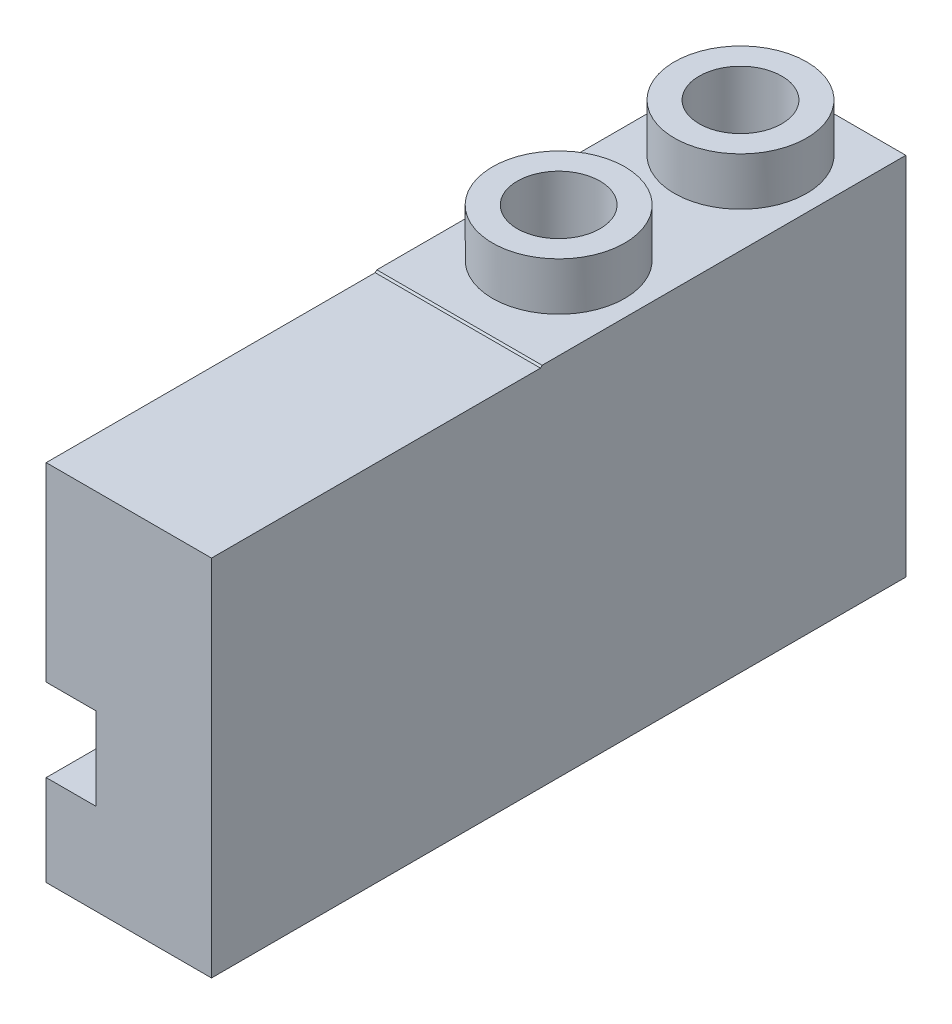
ISO-10303-21;
HEADER;
FILE_DESCRIPTION(('STEP AP214'),'2;1');
FILE_NAME('part.step','',(''),(''),'','','');
FILE_SCHEMA(('AUTOMOTIVE_DESIGN { 1 0 10303 214 1 1 1 1 }'));
ENDSEC;
DATA;
#1=APPLICATION_CONTEXT('core data for automotive mechanical design processes');
#2=APPLICATION_PROTOCOL_DEFINITION('international standard','automotive_design',2000,#1);
#3=PRODUCT_CONTEXT('',#1,'mechanical');
#4=PRODUCT('Part','Part','',(#3));
#5=PRODUCT_RELATED_PRODUCT_CATEGORY('part','',(#4));
#6=PRODUCT_DEFINITION_FORMATION('','',#4);
#7=PRODUCT_DEFINITION_CONTEXT('part definition',#1,'design');
#8=PRODUCT_DEFINITION('design','',#6,#7);
#9=PRODUCT_DEFINITION_SHAPE('','',#8);
#10=(LENGTH_UNIT() NAMED_UNIT(*) SI_UNIT(.MILLI.,.METRE.));
#11=(NAMED_UNIT(*) PLANE_ANGLE_UNIT() SI_UNIT($,.RADIAN.));
#12=(NAMED_UNIT(*) SI_UNIT($,.STERADIAN.) SOLID_ANGLE_UNIT());
#13=UNCERTAINTY_MEASURE_WITH_UNIT(LENGTH_MEASURE(1.E-05),#10,'distance_accuracy_value','');
#14=(GEOMETRIC_REPRESENTATION_CONTEXT(3) GLOBAL_UNCERTAINTY_ASSIGNED_CONTEXT((#13)) GLOBAL_UNIT_ASSIGNED_CONTEXT((#10,
#11,#12)) REPRESENTATION_CONTEXT('',''));
#15=CARTESIAN_POINT('',(0.,0.,0.));
#16=DIRECTION('',(0.,0.,1.));
#17=DIRECTION('',(1.,0.,0.));
#18=AXIS2_PLACEMENT_3D('',#15,#16,#17);
#19=CARTESIAN_POINT('',(-10.,10.5,-42.));
#20=DIRECTION('',(-1.,0.,0.));
#21=DIRECTION('',(0.,0.,1.));
#22=AXIS2_PLACEMENT_3D('',#19,#20,#21);
#23=PLANE('',#22);
#24=DIRECTION('',(0.,0.,-1.));
#25=VECTOR('',#24,1.);
#26=CARTESIAN_POINT('',(-10.,22.,0.));
#27=LINE('',#26,#25);
#28=CARTESIAN_POINT('',(-10.,22.,0.));
#29=VERTEX_POINT('',#28);
#30=CARTESIAN_POINT('',(-10.,22.,-19.9));
#31=VERTEX_POINT('',#30);
#32=EDGE_CURVE('E104',#29,#31,#27,.T.);
#33=ORIENTED_EDGE('',*,*,#32,.T.);
#34=DIRECTION('',(0.,0.707106781186522,-0.707106781186573));
#35=VECTOR('',#34,1.);
#36=CARTESIAN_POINT('',(-10.,22.,-19.9));
#37=LINE('',#36,#35);
#38=CARTESIAN_POINT('',(-10.,22.1,-20.));
#39=VERTEX_POINT('',#38);
#40=EDGE_CURVE('E92',#31,#39,#37,.T.);
#41=ORIENTED_EDGE('',*,*,#40,.T.);
#42=DIRECTION('',(0.,0.,-1.));
#43=VECTOR('',#42,1.);
#44=CARTESIAN_POINT('',(-10.,22.1,-20.));
#45=LINE('',#44,#43);
#46=CARTESIAN_POINT('',(-10.,22.1,-42.));
#47=VERTEX_POINT('',#46);
#48=EDGE_CURVE('E103',#47,#39,#45,.F.);
#49=ORIENTED_EDGE('',*,*,#48,.F.);
#50=DIRECTION('',(0.,-1.,0.));
#51=VECTOR('',#50,1.);
#52=CARTESIAN_POINT('',(-10.,22.1,-42.));
#53=LINE('',#52,#51);
#54=CARTESIAN_POINT('',(-10.,10.5,-42.));
#55=VERTEX_POINT('',#54);
#56=EDGE_CURVE('E125',#47,#55,#53,.T.);
#57=ORIENTED_EDGE('',*,*,#56,.T.);
#58=DIRECTION('',(0.,0.,1.));
#59=VECTOR('',#58,1.);
#60=CARTESIAN_POINT('',(-10.,10.5,-42.));
#61=LINE('',#60,#59);
#62=CARTESIAN_POINT('',(-10.,10.5,0.));
#63=VERTEX_POINT('',#62);
#64=EDGE_CURVE('E130',#55,#63,#61,.T.);
#65=ORIENTED_EDGE('',*,*,#64,.T.);
#66=DIRECTION('',(0.,1.,0.));
#67=VECTOR('',#66,1.);
#68=CARTESIAN_POINT('',(-10.,10.5,0.));
#69=LINE('',#68,#67);
#70=EDGE_CURVE('E117',#29,#63,#69,.F.);
#71=ORIENTED_EDGE('',*,*,#70,.F.);
#72=EDGE_LOOP('',(#33,#41,#49,#57,#65,#71));
#73=FACE_BOUND('',#72,.T.);
#74=ADVANCED_FACE('F16',(#73),#23,.T.);
#75=CARTESIAN_POINT('',(-10.,10.5,0.));
#76=DIRECTION('',(0.,-1.,0.));
#77=DIRECTION('',(0.,0.,-1.));
#78=AXIS2_PLACEMENT_3D('',#75,#76,#77);
#79=PLANE('',#78);
#80=DIRECTION('',(-1.,0.,0.));
#81=VECTOR('',#80,1.);
#82=CARTESIAN_POINT('',(-7.,10.5,0.));
#83=LINE('',#82,#81);
#84=CARTESIAN_POINT('',(-7.,10.5,0.));
#85=VERTEX_POINT('',#84);
#86=EDGE_CURVE('E137',#63,#85,#83,.F.);
#87=ORIENTED_EDGE('',*,*,#86,.F.);
#88=ORIENTED_EDGE('',*,*,#64,.F.);
#89=DIRECTION('',(1.,0.,0.));
#90=VECTOR('',#89,1.);
#91=CARTESIAN_POINT('',(-10.,10.5,-42.));
#92=LINE('',#91,#90);
#93=CARTESIAN_POINT('',(-7.,10.5,-42.));
#94=VERTEX_POINT('',#93);
#95=EDGE_CURVE('E141',#55,#94,#92,.T.);
#96=ORIENTED_EDGE('',*,*,#95,.T.);
#97=DIRECTION('',(0.,0.,1.));
#98=VECTOR('',#97,1.);
#99=CARTESIAN_POINT('',(-7.,10.5,-42.));
#100=LINE('',#99,#98);
#101=EDGE_CURVE('E146',#94,#85,#100,.T.);
#102=ORIENTED_EDGE('',*,*,#101,.T.);
#103=EDGE_LOOP('',(#87,#88,#96,#102));
#104=FACE_BOUND('',#103,.T.);
#105=ADVANCED_FACE('F293',(#104),#79,.T.);
#106=CARTESIAN_POINT('',(-7.,5.5,-42.));
#107=DIRECTION('',(-1.,0.,0.));
#108=DIRECTION('',(0.,0.,1.));
#109=AXIS2_PLACEMENT_3D('',#106,#107,#108);
#110=PLANE('',#109);
#111=DIRECTION('',(0.,1.,0.));
#112=VECTOR('',#111,1.);
#113=CARTESIAN_POINT('',(-7.,5.5,0.));
#114=LINE('',#113,#112);
#115=CARTESIAN_POINT('',(-7.,5.5,0.));
#116=VERTEX_POINT('',#115);
#117=EDGE_CURVE('E151',#85,#116,#114,.F.);
#118=ORIENTED_EDGE('',*,*,#117,.F.);
#119=ORIENTED_EDGE('',*,*,#101,.F.);
#120=DIRECTION('',(0.,-1.,0.));
#121=VECTOR('',#120,1.);
#122=CARTESIAN_POINT('',(-7.,10.5,-42.));
#123=LINE('',#122,#121);
#124=CARTESIAN_POINT('',(-7.,5.5,-42.));
#125=VERTEX_POINT('',#124);
#126=EDGE_CURVE('E155',#94,#125,#123,.T.);
#127=ORIENTED_EDGE('',*,*,#126,.T.);
#128=DIRECTION('',(0.,0.,1.));
#129=VECTOR('',#128,1.);
#130=CARTESIAN_POINT('',(-7.,5.5,-42.));
#131=LINE('',#130,#129);
#132=EDGE_CURVE('E160',#125,#116,#131,.T.);
#133=ORIENTED_EDGE('',*,*,#132,.T.);
#134=EDGE_LOOP('',(#118,#119,#127,#133));
#135=FACE_BOUND('',#134,.T.);
#136=ADVANCED_FACE('F298',(#135),#110,.T.);
#137=CARTESIAN_POINT('',(-10.,5.5,-42.));
#138=DIRECTION('',(0.,1.,0.));
#139=DIRECTION('',(0.,0.,1.));
#140=AXIS2_PLACEMENT_3D('',#137,#138,#139);
#141=PLANE('',#140);
#142=DIRECTION('',(1.,0.,0.));
#143=VECTOR('',#142,1.);
#144=CARTESIAN_POINT('',(-10.,5.5,0.));
#145=LINE('',#144,#143);
#146=CARTESIAN_POINT('',(-10.,5.5,0.));
#147=VERTEX_POINT('',#146);
#148=EDGE_CURVE('E165',#116,#147,#145,.F.);
#149=ORIENTED_EDGE('',*,*,#148,.F.);
#150=ORIENTED_EDGE('',*,*,#132,.F.);
#151=DIRECTION('',(-1.,0.,0.));
#152=VECTOR('',#151,1.);
#153=CARTESIAN_POINT('',(-7.,5.5,-42.));
#154=LINE('',#153,#152);
#155=CARTESIAN_POINT('',(-10.,5.5,-42.));
#156=VERTEX_POINT('',#155);
#157=EDGE_CURVE('E169',#125,#156,#154,.T.);
#158=ORIENTED_EDGE('',*,*,#157,.T.);
#159=DIRECTION('',(0.,0.,1.));
#160=VECTOR('',#159,1.);
#161=CARTESIAN_POINT('',(-10.,5.5,-42.));
#162=LINE('',#161,#160);
#163=EDGE_CURVE('E174',#156,#147,#162,.T.);
#164=ORIENTED_EDGE('',*,*,#163,.T.);
#165=EDGE_LOOP('',(#149,#150,#158,#164));
#166=FACE_BOUND('',#165,.T.);
#167=ADVANCED_FACE('F304',(#166),#141,.T.);
#168=CARTESIAN_POINT('',(-10.,0.,-42.));
#169=DIRECTION('',(-1.,0.,0.));
#170=DIRECTION('',(0.,0.,1.));
#171=AXIS2_PLACEMENT_3D('',#168,#169,#170);
#172=PLANE('',#171);
#173=DIRECTION('',(0.,1.,0.));
#174=VECTOR('',#173,1.);
#175=CARTESIAN_POINT('',(-10.,0.,0.));
#176=LINE('',#175,#174);
#177=CARTESIAN_POINT('',(-10.,0.,0.));
#178=VERTEX_POINT('',#177);
#179=EDGE_CURVE('E179',#147,#178,#176,.F.);
#180=ORIENTED_EDGE('',*,*,#179,.F.);
#181=ORIENTED_EDGE('',*,*,#163,.F.);
#182=DIRECTION('',(0.,-1.,0.));
#183=VECTOR('',#182,1.);
#184=CARTESIAN_POINT('',(-10.,5.5,-42.));
#185=LINE('',#184,#183);
#186=CARTESIAN_POINT('',(-10.,0.,-42.));
#187=VERTEX_POINT('',#186);
#188=EDGE_CURVE('E183',#156,#187,#185,.T.);
#189=ORIENTED_EDGE('',*,*,#188,.T.);
#190=DIRECTION('',(0.,0.,1.));
#191=VECTOR('',#190,1.);
#192=CARTESIAN_POINT('',(-10.,0.,-42.));
#193=LINE('',#192,#191);
#194=EDGE_CURVE('E188',#187,#178,#193,.T.);
#195=ORIENTED_EDGE('',*,*,#194,.T.);
#196=EDGE_LOOP('',(#180,#181,#189,#195));
#197=FACE_BOUND('',#196,.T.);
#198=ADVANCED_FACE('F308',(#197),#172,.T.);
#199=CARTESIAN_POINT('',(-10.,0.,0.));
#200=DIRECTION('',(0.,-1.,0.));
#201=DIRECTION('',(0.,0.,-1.));
#202=AXIS2_PLACEMENT_3D('',#199,#200,#201);
#203=PLANE('',#202);
#204=DIRECTION('',(-1.,0.,0.));
#205=VECTOR('',#204,1.);
#206=CARTESIAN_POINT('',(0.,0.,0.));
#207=LINE('',#206,#205);
#208=CARTESIAN_POINT('',(0.,0.,0.));
#209=VERTEX_POINT('',#208);
#210=EDGE_CURVE('E193',#178,#209,#207,.F.);
#211=ORIENTED_EDGE('',*,*,#210,.F.);
#212=ORIENTED_EDGE('',*,*,#194,.F.);
#213=DIRECTION('',(1.,0.,0.));
#214=VECTOR('',#213,1.);
#215=CARTESIAN_POINT('',(-10.,0.,-42.));
#216=LINE('',#215,#214);
#217=CARTESIAN_POINT('',(0.,0.,-42.));
#218=VERTEX_POINT('',#217);
#219=EDGE_CURVE('E197',#187,#218,#216,.T.);
#220=ORIENTED_EDGE('',*,*,#219,.T.);
#221=DIRECTION('',(0.,0.,1.));
#222=VECTOR('',#221,1.);
#223=CARTESIAN_POINT('',(0.,0.,-42.));
#224=LINE('',#223,#222);
#225=EDGE_CURVE('E202',#218,#209,#224,.T.);
#226=ORIENTED_EDGE('',*,*,#225,.T.);
#227=EDGE_LOOP('',(#211,#212,#220,#226));
#228=FACE_BOUND('',#227,.T.);
#229=ADVANCED_FACE('F312',(#228),#203,.T.);
#230=CARTESIAN_POINT('',(0.,0.,0.));
#231=DIRECTION('',(1.,0.,0.));
#232=DIRECTION('',(0.,0.,-1.));
#233=AXIS2_PLACEMENT_3D('',#230,#231,#232);
#234=PLANE('',#233);
#235=DIRECTION('',(0.,0.,1.));
#236=VECTOR('',#235,1.);
#237=CARTESIAN_POINT('',(0.,22.,-19.9));
#238=LINE('',#237,#236);
#239=CARTESIAN_POINT('',(0.,22.,0.));
#240=VERTEX_POINT('',#239);
#241=CARTESIAN_POINT('',(0.,22.,-19.9));
#242=VERTEX_POINT('',#241);
#243=EDGE_CURVE('E111',#240,#242,#238,.F.);
#244=ORIENTED_EDGE('',*,*,#243,.F.);
#245=DIRECTION('',(0.,-1.,0.));
#246=VECTOR('',#245,1.);
#247=CARTESIAN_POINT('',(0.,22.,0.));
#248=LINE('',#247,#246);
#249=EDGE_CURVE('E210',#209,#240,#248,.F.);
#250=ORIENTED_EDGE('',*,*,#249,.F.);
#251=ORIENTED_EDGE('',*,*,#225,.F.);
#252=DIRECTION('',(0.,1.,0.));
#253=VECTOR('',#252,1.);
#254=CARTESIAN_POINT('',(0.,0.,-42.));
#255=LINE('',#254,#253);
#256=CARTESIAN_POINT('',(0.,22.1,-42.));
#257=VERTEX_POINT('',#256);
#258=EDGE_CURVE('E215',#218,#257,#255,.T.);
#259=ORIENTED_EDGE('',*,*,#258,.T.);
#260=DIRECTION('',(0.,0.,1.));
#261=VECTOR('',#260,1.);
#262=CARTESIAN_POINT('',(0.,22.1,-42.));
#263=LINE('',#262,#261);
#264=CARTESIAN_POINT('',(0.,22.1,-20.));
#265=VERTEX_POINT('',#264);
#266=EDGE_CURVE('E220',#257,#265,#263,.T.);
#267=ORIENTED_EDGE('',*,*,#266,.T.);
#268=DIRECTION('',(0.,-0.707106781186548,0.707106781186548));
#269=VECTOR('',#268,1.);
#270=CARTESIAN_POINT('',(0.,22.1,-20.));
#271=LINE('',#270,#269);
#272=EDGE_CURVE('E225',#242,#265,#271,.F.);
#273=ORIENTED_EDGE('',*,*,#272,.F.);
#274=EDGE_LOOP('',(#244,#250,#251,#259,#267,#273));
#275=FACE_BOUND('',#274,.T.);
#276=ADVANCED_FACE('F316',(#275),#234,.T.);
#277=CARTESIAN_POINT('',(-10.,22.1,-42.));
#278=DIRECTION('',(0.,1.,0.));
#279=DIRECTION('',(0.,0.,1.));
#280=AXIS2_PLACEMENT_3D('',#277,#278,#279);
#281=PLANE('',#280);
#282=DIRECTION('',(1.,0.,0.));
#283=VECTOR('',#282,1.);
#284=CARTESIAN_POINT('',(-10.,22.1,-20.));
#285=LINE('',#284,#283);
#286=EDGE_CURVE('E98',#39,#265,#285,.T.);
#287=ORIENTED_EDGE('',*,*,#286,.T.);
#288=ORIENTED_EDGE('',*,*,#266,.F.);
#289=DIRECTION('',(-1.,0.,0.));
#290=VECTOR('',#289,1.);
#291=CARTESIAN_POINT('',(0.,22.1,-42.));
#292=LINE('',#291,#290);
#293=EDGE_CURVE('E232',#257,#47,#292,.T.);
#294=ORIENTED_EDGE('',*,*,#293,.T.);
#295=ORIENTED_EDGE('',*,*,#48,.T.);
#296=EDGE_LOOP('',(#287,#288,#294,#295));
#297=FACE_BOUND('',#296,.T.);
#298=CARTESIAN_POINT('',(-5.,22.1,-37.));
#299=DIRECTION('',(0.,-1.,0.));
#300=DIRECTION('',(0.,0.,1.));
#301=AXIS2_PLACEMENT_3D('',#298,#299,#300);
#302=CIRCLE('',#301,4.);
#303=CARTESIAN_POINT('',(-5.,22.1,-33.));
#304=VERTEX_POINT('',#303);
#305=EDGE_CURVE('E237',#304,#304,#302,.F.);
#306=ORIENTED_EDGE('',*,*,#305,.F.);
#307=EDGE_LOOP('',(#306));
#308=FACE_BOUND('',#307,.T.);
#309=CARTESIAN_POINT('',(-5.,22.1,-26.));
#310=DIRECTION('',(0.,-1.,0.));
#311=DIRECTION('',(0.,0.,1.));
#312=AXIS2_PLACEMENT_3D('',#309,#310,#311);
#313=CIRCLE('',#312,4.);
#314=CARTESIAN_POINT('',(-5.,22.1,-22.));
#315=VERTEX_POINT('',#314);
#316=EDGE_CURVE('E242',#315,#315,#313,.F.);
#317=ORIENTED_EDGE('',*,*,#316,.F.);
#318=EDGE_LOOP('',(#317));
#319=FACE_BOUND('',#318,.T.);
#320=ADVANCED_FACE('F320',(#297,#308,#319),#281,.T.);
#321=CARTESIAN_POINT('',(-10.,0.,-42.));
#322=DIRECTION('',(0.,0.,-1.));
#323=DIRECTION('',(0.,1.,0.));
#324=AXIS2_PLACEMENT_3D('',#321,#322,#323);
#325=PLANE('',#324);
#326=ORIENTED_EDGE('',*,*,#56,.F.);
#327=ORIENTED_EDGE('',*,*,#293,.F.);
#328=ORIENTED_EDGE('',*,*,#258,.F.);
#329=ORIENTED_EDGE('',*,*,#219,.F.);
#330=ORIENTED_EDGE('',*,*,#188,.F.);
#331=ORIENTED_EDGE('',*,*,#157,.F.);
#332=ORIENTED_EDGE('',*,*,#126,.F.);
#333=ORIENTED_EDGE('',*,*,#95,.F.);
#334=EDGE_LOOP('',(#326,#327,#328,#329,#330,#331,#332,#333));
#335=FACE_BOUND('',#334,.T.);
#336=ADVANCED_FACE('F324',(#335),#325,.T.);
#337=CARTESIAN_POINT('',(-10.,0.,0.));
#338=DIRECTION('',(0.,0.,1.));
#339=DIRECTION('',(1.,0.,0.));
#340=AXIS2_PLACEMENT_3D('',#337,#338,#339);
#341=PLANE('',#340);
#342=DIRECTION('',(-1.,0.,0.));
#343=VECTOR('',#342,1.);
#344=CARTESIAN_POINT('',(0.,22.,0.));
#345=LINE('',#344,#343);
#346=EDGE_CURVE('E113',#29,#240,#345,.F.);
#347=ORIENTED_EDGE('',*,*,#346,.F.);
#348=ORIENTED_EDGE('',*,*,#70,.T.);
#349=ORIENTED_EDGE('',*,*,#86,.T.);
#350=ORIENTED_EDGE('',*,*,#117,.T.);
#351=ORIENTED_EDGE('',*,*,#148,.T.);
#352=ORIENTED_EDGE('',*,*,#179,.T.);
#353=ORIENTED_EDGE('',*,*,#210,.T.);
#354=ORIENTED_EDGE('',*,*,#249,.T.);
#355=EDGE_LOOP('',(#347,#348,#349,#350,#351,#352,#353,#354));
#356=FACE_BOUND('',#355,.T.);
#357=ADVANCED_FACE('F328',(#356),#341,.T.);
#358=CARTESIAN_POINT('',(-10.,22.,0.));
#359=DIRECTION('',(0.,1.,0.));
#360=DIRECTION('',(1.,0.,0.));
#361=AXIS2_PLACEMENT_3D('',#358,#359,#360);
#362=PLANE('',#361);
#363=ORIENTED_EDGE('',*,*,#243,.T.);
#364=DIRECTION('',(-1.,0.,0.));
#365=VECTOR('',#364,1.);
#366=CARTESIAN_POINT('',(0.,22.,-19.9));
#367=LINE('',#366,#365);
#368=EDGE_CURVE('E95',#31,#242,#367,.F.);
#369=ORIENTED_EDGE('',*,*,#368,.F.);
#370=ORIENTED_EDGE('',*,*,#32,.F.);
#371=ORIENTED_EDGE('',*,*,#346,.T.);
#372=EDGE_LOOP('',(#363,#369,#370,#371));
#373=FACE_BOUND('',#372,.T.);
#374=ADVANCED_FACE('F108',(#373),#362,.T.);
#375=CARTESIAN_POINT('',(-10.,22.,-19.9));
#376=DIRECTION('',(0.,0.707106781186548,0.707106781186548));
#377=DIRECTION('',(1.,0.,0.));
#378=AXIS2_PLACEMENT_3D('',#375,#376,#377);
#379=PLANE('',#378);
#380=ORIENTED_EDGE('',*,*,#272,.T.);
#381=ORIENTED_EDGE('',*,*,#286,.F.);
#382=ORIENTED_EDGE('',*,*,#40,.F.);
#383=ORIENTED_EDGE('',*,*,#368,.T.);
#384=EDGE_LOOP('',(#380,#381,#382,#383));
#385=FACE_BOUND('',#384,.T.);
#386=ADVANCED_FACE('F94',(#385),#379,.T.);
#387=CARTESIAN_POINT('',(-9.,25.,-41.));
#388=DIRECTION('',(0.,1.,0.));
#389=DIRECTION('',(0.,0.,1.));
#390=AXIS2_PLACEMENT_3D('',#387,#388,#389);
#391=PLANE('',#390);
#392=CARTESIAN_POINT('',(-5.,25.,-37.));
#393=DIRECTION('',(0.,1.,0.));
#394=DIRECTION('',(0.,0.,-1.));
#395=AXIS2_PLACEMENT_3D('',#392,#393,#394);
#396=CIRCLE('',#395,4.);
#397=CARTESIAN_POINT('',(-5.,25.,-41.));
#398=VERTEX_POINT('',#397);
#399=EDGE_CURVE('E112',#398,#398,#396,.T.);
#400=ORIENTED_EDGE('',*,*,#399,.T.);
#401=EDGE_LOOP('',(#400));
#402=FACE_BOUND('',#401,.T.);
#403=CARTESIAN_POINT('',(-5.,25.,-37.));
#404=DIRECTION('',(0.,-1.,0.));
#405=DIRECTION('',(0.,0.,1.));
#406=AXIS2_PLACEMENT_3D('',#403,#404,#405);
#407=CIRCLE('',#406,2.5);
#408=CARTESIAN_POINT('',(-5.,25.,-34.5));
#409=VERTEX_POINT('',#408);
#410=EDGE_CURVE('E252',#409,#409,#407,.F.);
#411=ORIENTED_EDGE('',*,*,#410,.F.);
#412=EDGE_LOOP('',(#411));
#413=FACE_BOUND('',#412,.T.);
#414=ADVANCED_FACE('F337',(#402,#413),#391,.T.);
#415=CARTESIAN_POINT('',(-7.49999987856925,20.1,-39.5000001924006));
#416=DIRECTION('',(0.,1.,0.));
#417=DIRECTION('',(0.,0.,1.));
#418=AXIS2_PLACEMENT_3D('',#415,#416,#417);
#419=PLANE('',#418);
#420=CARTESIAN_POINT('',(-5.,20.1,-37.));
#421=DIRECTION('',(0.,1.,0.));
#422=DIRECTION('',(-1.42402931402331E-07,0.,-0.99999999999999));
#423=AXIS2_PLACEMENT_3D('',#420,#421,#422);
#424=CIRCLE('',#423,2.5);
#425=CARTESIAN_POINT('',(-5.00000035600733,20.1,-39.5));
#426=VERTEX_POINT('',#425);
#427=EDGE_CURVE('E255',#426,#426,#424,.T.);
#428=ORIENTED_EDGE('',*,*,#427,.T.);
#429=EDGE_LOOP('',(#428));
#430=FACE_BOUND('',#429,.T.);
#431=CARTESIAN_POINT('',(-5.,20.1,-37.));
#432=DIRECTION('',(0.,-1.,0.));
#433=DIRECTION('',(0.,0.,1.));
#434=AXIS2_PLACEMENT_3D('',#431,#432,#433);
#435=CIRCLE('',#434,2.067);
#436=CARTESIAN_POINT('',(-5.,20.1,-34.933));
#437=VERTEX_POINT('',#436);
#438=EDGE_CURVE('E258',#437,#437,#435,.F.);
#439=ORIENTED_EDGE('',*,*,#438,.F.);
#440=EDGE_LOOP('',(#439));
#441=FACE_BOUND('',#440,.T.);
#442=ADVANCED_FACE('F340',(#430,#441),#419,.T.);
#443=CARTESIAN_POINT('',(-8.99999980637686,25.,-30.0000003067857));
#444=DIRECTION('',(0.,1.,0.));
#445=DIRECTION('',(0.,0.,1.));
#446=AXIS2_PLACEMENT_3D('',#443,#444,#445);
#447=PLANE('',#446);
#448=CARTESIAN_POINT('',(-5.,25.,-26.));
#449=DIRECTION('',(0.,1.,0.));
#450=DIRECTION('',(-1.41914744844485E-07,0.,-0.99999999999999));
#451=AXIS2_PLACEMENT_3D('',#448,#449,#450);
#452=CIRCLE('',#451,4.);
#453=CARTESIAN_POINT('',(-5.00000056765898,25.,-30.));
#454=VERTEX_POINT('',#453);
#455=EDGE_CURVE('E261',#454,#454,#452,.T.);
#456=ORIENTED_EDGE('',*,*,#455,.T.);
#457=EDGE_LOOP('',(#456));
#458=FACE_BOUND('',#457,.T.);
#459=CARTESIAN_POINT('',(-5.,25.,-26.));
#460=DIRECTION('',(0.,-1.,0.));
#461=DIRECTION('',(0.,0.,1.));
#462=AXIS2_PLACEMENT_3D('',#459,#460,#461);
#463=CIRCLE('',#462,2.5);
#464=CARTESIAN_POINT('',(-5.,25.,-23.5));
#465=VERTEX_POINT('',#464);
#466=EDGE_CURVE('E264',#465,#465,#463,.F.);
#467=ORIENTED_EDGE('',*,*,#466,.F.);
#468=EDGE_LOOP('',(#467));
#469=FACE_BOUND('',#468,.T.);
#470=ADVANCED_FACE('F344',(#458,#469),#447,.T.);
#471=CARTESIAN_POINT('',(-7.49999987885583,20.1,-28.5000001919466));
#472=DIRECTION('',(0.,1.,0.));
#473=DIRECTION('',(0.,0.,1.));
#474=AXIS2_PLACEMENT_3D('',#471,#472,#473);
#475=PLANE('',#474);
#476=CARTESIAN_POINT('',(-5.,20.1,-26.));
#477=DIRECTION('',(0.,1.,0.));
#478=DIRECTION('',(-1.42066849662115E-07,0.,-0.99999999999999));
#479=AXIS2_PLACEMENT_3D('',#476,#477,#478);
#480=CIRCLE('',#479,2.5);
#481=CARTESIAN_POINT('',(-5.00000035516712,20.1,-28.5));
#482=VERTEX_POINT('',#481);
#483=EDGE_CURVE('E267',#482,#482,#480,.T.);
#484=ORIENTED_EDGE('',*,*,#483,.T.);
#485=EDGE_LOOP('',(#484));
#486=FACE_BOUND('',#485,.T.);
#487=CARTESIAN_POINT('',(-5.,20.1,-26.));
#488=DIRECTION('',(0.,-1.,0.));
#489=DIRECTION('',(0.,0.,1.));
#490=AXIS2_PLACEMENT_3D('',#487,#488,#489);
#491=CIRCLE('',#490,2.067);
#492=CARTESIAN_POINT('',(-5.,20.1,-23.933));
#493=VERTEX_POINT('',#492);
#494=EDGE_CURVE('E270',#493,#493,#491,.F.);
#495=ORIENTED_EDGE('',*,*,#494,.F.);
#496=EDGE_LOOP('',(#495));
#497=FACE_BOUND('',#496,.T.);
#498=ADVANCED_FACE('F348',(#486,#497),#475,.T.);
#499=CARTESIAN_POINT('',(-5.,25.,-37.));
#500=DIRECTION('',(0.,1.,0.));
#501=DIRECTION('',(0.,0.,-1.));
#502=AXIS2_PLACEMENT_3D('',#499,#500,#501);
#503=CYLINDRICAL_SURFACE('',#502,4.);
#504=ORIENTED_EDGE('',*,*,#305,.T.);
#505=EDGE_LOOP('',(#504));
#506=FACE_BOUND('',#505,.T.);
#507=ORIENTED_EDGE('',*,*,#399,.F.);
#508=EDGE_LOOP('',(#507));
#509=FACE_BOUND('',#508,.T.);
#510=ADVANCED_FACE('F352',(#506,#509),#503,.T.);
#511=CARTESIAN_POINT('',(-5.,25.,-37.));
#512=DIRECTION('',(0.,1.,0.));
#513=DIRECTION('',(1.42054096164197E-07,0.,-0.99999999999999));
#514=AXIS2_PLACEMENT_3D('',#511,#512,#513);
#515=CYLINDRICAL_SURFACE('',#514,2.5);
#516=ORIENTED_EDGE('',*,*,#410,.T.);
#517=EDGE_LOOP('',(#516));
#518=FACE_BOUND('',#517,.T.);
#519=ORIENTED_EDGE('',*,*,#427,.F.);
#520=EDGE_LOOP('',(#519));
#521=FACE_BOUND('',#520,.T.);
#522=ADVANCED_FACE('F290',(#518,#521),#515,.F.);
#523=CARTESIAN_POINT('',(-5.,12.580171599572,-37.));
#524=DIRECTION('',(0.,1.,0.));
#525=DIRECTION('',(0.,0.,-1.));
#526=AXIS2_PLACEMENT_3D('',#523,#524,#525);
#527=CONICAL_SURFACE('',#526,2.067,1.02974425867664);
#528=CARTESIAN_POINT('',(-5.,12.580171599572,-37.));
#529=DIRECTION('',(0.,1.,0.));
#530=DIRECTION('',(0.,0.,-1.));
#531=AXIS2_PLACEMENT_3D('',#528,#529,#530);
#532=CIRCLE('',#531,2.067);
#533=CARTESIAN_POINT('',(-5.,12.580171599572,-39.067));
#534=VERTEX_POINT('',#533);
#535=EDGE_CURVE('E24',#534,#534,#532,.T.);
#536=ORIENTED_EDGE('',*,*,#535,.T.);
#537=EDGE_LOOP('',(#536));
#538=FACE_BOUND('',#537,.T.);
#539=CARTESIAN_POINT('',(-5.,11.338192700042,-37.));
#540=VERTEX_POINT('',#539);
#541=VERTEX_LOOP('',#540);
#542=FACE_BOUND('',#541,.T.);
#543=ADVANCED_FACE('F275',(#538,#542),#527,.F.);
#544=CARTESIAN_POINT('',(-5.,22.1,-37.));
#545=DIRECTION('',(0.,1.,0.));
#546=DIRECTION('',(1.41804136111541E-07,0.,-0.99999999999999));
#547=AXIS2_PLACEMENT_3D('',#544,#545,#546);
#548=CYLINDRICAL_SURFACE('',#547,2.067);
#549=ORIENTED_EDGE('',*,*,#438,.T.);
#550=EDGE_LOOP('',(#549));
#551=FACE_BOUND('',#550,.T.);
#552=ORIENTED_EDGE('',*,*,#535,.F.);
#553=EDGE_LOOP('',(#552));
#554=FACE_BOUND('',#553,.T.);
#555=ADVANCED_FACE('F277',(#551,#554),#548,.F.);
#556=CARTESIAN_POINT('',(-5.,25.,-26.));
#557=DIRECTION('',(0.,1.,0.));
#558=DIRECTION('',(0.,0.,-1.));
#559=AXIS2_PLACEMENT_3D('',#556,#557,#558);
#560=CYLINDRICAL_SURFACE('',#559,4.);
#561=ORIENTED_EDGE('',*,*,#316,.T.);
#562=EDGE_LOOP('',(#561));
#563=FACE_BOUND('',#562,.T.);
#564=ORIENTED_EDGE('',*,*,#455,.F.);
#565=EDGE_LOOP('',(#564));
#566=FACE_BOUND('',#565,.T.);
#567=ADVANCED_FACE('F279',(#563,#566),#560,.T.);
#568=CARTESIAN_POINT('',(-5.,25.,-26.));
#569=DIRECTION('',(0.,1.,0.));
#570=DIRECTION('',(0.,0.,-1.));
#571=AXIS2_PLACEMENT_3D('',#568,#569,#570);
#572=CYLINDRICAL_SURFACE('',#571,2.5);
#573=ORIENTED_EDGE('',*,*,#466,.T.);
#574=EDGE_LOOP('',(#573));
#575=FACE_BOUND('',#574,.T.);
#576=ORIENTED_EDGE('',*,*,#483,.F.);
#577=EDGE_LOOP('',(#576));
#578=FACE_BOUND('',#577,.T.);
#579=ADVANCED_FACE('F287',(#575,#578),#572,.F.);
#580=CARTESIAN_POINT('',(-5.,12.580171599572,-26.));
#581=DIRECTION('',(0.,1.,0.));
#582=DIRECTION('',(0.,0.,-1.));
#583=AXIS2_PLACEMENT_3D('',#580,#581,#582);
#584=CONICAL_SURFACE('',#583,2.067,1.02974425867664);
#585=CARTESIAN_POINT('',(-5.,12.580171599572,-26.));
#586=DIRECTION('',(0.,1.,0.));
#587=DIRECTION('',(0.,0.,-1.));
#588=AXIS2_PLACEMENT_3D('',#585,#586,#587);
#589=CIRCLE('',#588,2.067);
#590=CARTESIAN_POINT('',(-5.,12.580171599572,-28.067));
#591=VERTEX_POINT('',#590);
#592=EDGE_CURVE('E10',#591,#591,#589,.T.);
#593=ORIENTED_EDGE('',*,*,#592,.T.);
#594=EDGE_LOOP('',(#593));
#595=FACE_BOUND('',#594,.T.);
#596=CARTESIAN_POINT('',(-5.,11.338192700042,-26.));
#597=VERTEX_POINT('',#596);
#598=VERTEX_LOOP('',#597);
#599=FACE_BOUND('',#598,.T.);
#600=ADVANCED_FACE('F397',(#595,#599),#584,.F.);
#601=CARTESIAN_POINT('',(-5.,22.1,-26.));
#602=DIRECTION('',(0.,1.,0.));
#603=DIRECTION('',(1.41804700993016E-07,0.,-0.99999999999999));
#604=AXIS2_PLACEMENT_3D('',#601,#602,#603);
#605=CYLINDRICAL_SURFACE('',#604,2.067);
#606=ORIENTED_EDGE('',*,*,#494,.T.);
#607=EDGE_LOOP('',(#606));
#608=FACE_BOUND('',#607,.T.);
#609=ORIENTED_EDGE('',*,*,#592,.F.);
#610=EDGE_LOOP('',(#609));
#611=FACE_BOUND('',#610,.T.);
#612=ADVANCED_FACE('F18',(#608,#611),#605,.F.);
#613=CLOSED_SHELL('',(#74,#105,#136,#167,#198,#229,#276,#320,#336,#357,#374,#386,#414,#442,#470,
#498,#510,#522,#543,#555,#567,#579,#600,#612));
#614=MANIFOLD_SOLID_BREP('B1',#613);
#615=ADVANCED_BREP_SHAPE_REPRESENTATION('',(#18,#614),#14);
#616=SHAPE_DEFINITION_REPRESENTATION(#9,#615);
ENDSEC;
END-ISO-10303-21;
